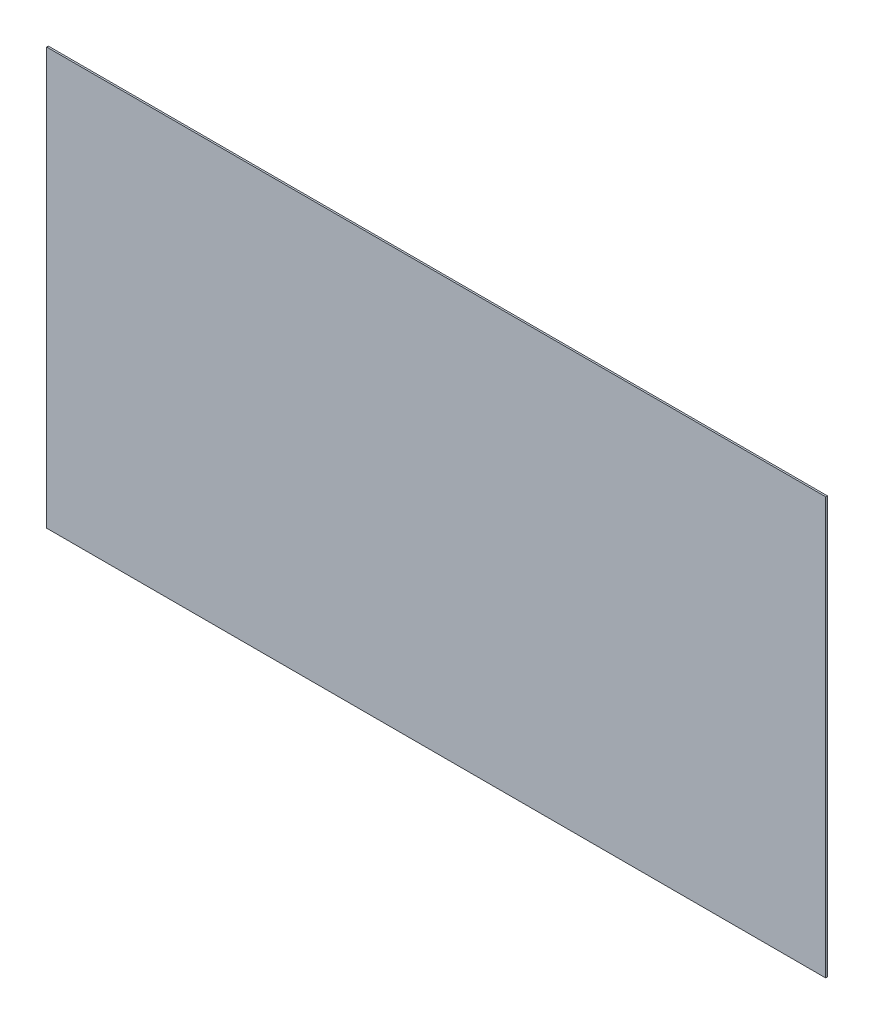
ISO-10303-21;
HEADER;
FILE_DESCRIPTION(('STEP AP214'),'2;1');
FILE_NAME('part.step','',(''),(''),'','','');
FILE_SCHEMA(('AUTOMOTIVE_DESIGN { 1 0 10303 214 1 1 1 1 }'));
ENDSEC;
DATA;
#1=APPLICATION_CONTEXT('core data for automotive mechanical design processes');
#2=APPLICATION_PROTOCOL_DEFINITION('international standard','automotive_design',2000,#1);
#3=PRODUCT_CONTEXT('',#1,'mechanical');
#4=PRODUCT('Part','Part','',(#3));
#5=PRODUCT_RELATED_PRODUCT_CATEGORY('part','',(#4));
#6=PRODUCT_DEFINITION_FORMATION('','',#4);
#7=PRODUCT_DEFINITION_CONTEXT('part definition',#1,'design');
#8=PRODUCT_DEFINITION('design','',#6,#7);
#9=PRODUCT_DEFINITION_SHAPE('','',#8);
#10=(LENGTH_UNIT() NAMED_UNIT(*) SI_UNIT(.MILLI.,.METRE.));
#11=(NAMED_UNIT(*) PLANE_ANGLE_UNIT() SI_UNIT($,.RADIAN.));
#12=(NAMED_UNIT(*) SI_UNIT($,.STERADIAN.) SOLID_ANGLE_UNIT());
#13=UNCERTAINTY_MEASURE_WITH_UNIT(LENGTH_MEASURE(1.E-05),#10,'distance_accuracy_value','');
#14=(GEOMETRIC_REPRESENTATION_CONTEXT(3) GLOBAL_UNCERTAINTY_ASSIGNED_CONTEXT((#13)) GLOBAL_UNIT_ASSIGNED_CONTEXT((#10,
#11,#12)) REPRESENTATION_CONTEXT('',''));
#15=CARTESIAN_POINT('',(0.,0.,0.));
#16=DIRECTION('',(0.,0.,1.));
#17=DIRECTION('',(1.,0.,0.));
#18=AXIS2_PLACEMENT_3D('',#15,#16,#17);
#19=CARTESIAN_POINT('',(-1162.,-621.5,1.193711796077E-12));
#20=DIRECTION('',(0.,0.,1.));
#21=DIRECTION('',(0.,-1.,0.));
#22=AXIS2_PLACEMENT_3D('',#19,#20,#21);
#23=PLANE('',#22);
#24=DIRECTION('',(0.,1.,0.));
#25=VECTOR('',#24,1.);
#26=CARTESIAN_POINT('',(-1162.,-621.5,1.193711796077E-12));
#27=LINE('',#26,#25);
#28=CARTESIAN_POINT('',(-1162.,-621.5,9.094947017729E-13));
#29=VERTEX_POINT('',#28);
#30=CARTESIAN_POINT('',(-1162.,621.5,9.094947017729E-13));
#31=VERTEX_POINT('',#30);
#32=EDGE_CURVE('E169',#29,#31,#27,.T.);
#33=ORIENTED_EDGE('',*,*,#32,.F.);
#34=DIRECTION('',(1.,0.,0.));
#35=VECTOR('',#34,1.);
#36=CARTESIAN_POINT('',(-1162.,-621.5,1.193711796077E-12));
#37=LINE('',#36,#35);
#38=CARTESIAN_POINT('',(1162.,-621.5,9.094947017729E-13));
#39=VERTEX_POINT('',#38);
#40=EDGE_CURVE('E78',#29,#39,#37,.T.);
#41=ORIENTED_EDGE('',*,*,#40,.T.);
#42=DIRECTION('',(0.,1.,0.));
#43=VECTOR('',#42,1.);
#44=CARTESIAN_POINT('',(1162.,-621.5,1.250555214938E-12));
#45=LINE('',#44,#43);
#46=CARTESIAN_POINT('',(1162.,621.5,9.094947017729E-13));
#47=VERTEX_POINT('',#46);
#48=EDGE_CURVE('E90',#39,#47,#45,.T.);
#49=ORIENTED_EDGE('',*,*,#48,.T.);
#50=DIRECTION('',(1.,0.,0.));
#51=VECTOR('',#50,1.);
#52=CARTESIAN_POINT('',(-1162.,621.5,1.136868377216E-12));
#53=LINE('',#52,#51);
#54=EDGE_CURVE('E11',#31,#47,#53,.T.);
#55=ORIENTED_EDGE('',*,*,#54,.F.);
#56=EDGE_LOOP('',(#33,#41,#49,#55));
#57=FACE_BOUND('',#56,.T.);
#58=ADVANCED_FACE('F17',(#57),#23,.T.);
#59=CARTESIAN_POINT('',(-1162.,-621.5,-4.999999999999));
#60=DIRECTION('',(0.,0.,1.));
#61=DIRECTION('',(0.,-1.,0.));
#62=AXIS2_PLACEMENT_3D('',#59,#60,#61);
#63=PLANE('',#62);
#64=DIRECTION('',(1.,0.,0.));
#65=VECTOR('',#64,1.);
#66=CARTESIAN_POINT('',(-1162.,621.5,-4.999999999999));
#67=LINE('',#66,#65);
#68=CARTESIAN_POINT('',(-1162.,621.5,-4.999999999999));
#69=VERTEX_POINT('',#68);
#70=CARTESIAN_POINT('',(1162.,621.5,-4.999999999999));
#71=VERTEX_POINT('',#70);
#72=EDGE_CURVE('E25',#69,#71,#67,.T.);
#73=ORIENTED_EDGE('',*,*,#72,.T.);
#74=DIRECTION('',(0.,1.,0.));
#75=VECTOR('',#74,1.);
#76=CARTESIAN_POINT('',(1162.,-621.5,-4.999999999999));
#77=LINE('',#76,#75);
#78=CARTESIAN_POINT('',(1162.,-621.5,-4.999999999999));
#79=VERTEX_POINT('',#78);
#80=EDGE_CURVE('E81',#79,#71,#77,.T.);
#81=ORIENTED_EDGE('',*,*,#80,.F.);
#82=DIRECTION('',(1.,0.,0.));
#83=VECTOR('',#82,1.);
#84=CARTESIAN_POINT('',(-1162.,-621.5,-4.999999999999));
#85=LINE('',#84,#83);
#86=CARTESIAN_POINT('',(-1162.,-621.5,-4.999999999999));
#87=VERTEX_POINT('',#86);
#88=EDGE_CURVE('E70',#87,#79,#85,.T.);
#89=ORIENTED_EDGE('',*,*,#88,.F.);
#90=DIRECTION('',(0.,1.,0.));
#91=VECTOR('',#90,1.);
#92=CARTESIAN_POINT('',(-1162.,-621.5,-4.999999999999));
#93=LINE('',#92,#91);
#94=EDGE_CURVE('E96',#87,#69,#93,.T.);
#95=ORIENTED_EDGE('',*,*,#94,.T.);
#96=EDGE_LOOP('',(#73,#81,#89,#95));
#97=FACE_BOUND('',#96,.T.);
#98=ADVANCED_FACE('F82',(#97),#63,.F.);
#99=CARTESIAN_POINT('',(-1162.,621.5,-4.999999999999));
#100=DIRECTION('',(0.,1.,0.));
#101=DIRECTION('',(1.,0.,0.));
#102=AXIS2_PLACEMENT_3D('',#99,#100,#101);
#103=PLANE('',#102);
#104=ORIENTED_EDGE('',*,*,#72,.F.);
#105=DIRECTION('',(0.,0.,1.));
#106=VECTOR('',#105,1.);
#107=CARTESIAN_POINT('',(-1162.,621.5,-4.999999999999));
#108=LINE('',#107,#106);
#109=EDGE_CURVE('E172',#69,#31,#108,.T.);
#110=ORIENTED_EDGE('',*,*,#109,.T.);
#111=ORIENTED_EDGE('',*,*,#54,.T.);
#112=DIRECTION('',(0.,0.,1.));
#113=VECTOR('',#112,1.);
#114=CARTESIAN_POINT('',(1162.,621.5,-4.999999999999));
#115=LINE('',#114,#113);
#116=EDGE_CURVE('E86',#71,#47,#115,.T.);
#117=ORIENTED_EDGE('',*,*,#116,.F.);
#118=EDGE_LOOP('',(#104,#110,#111,#117));
#119=FACE_BOUND('',#118,.T.);
#120=ADVANCED_FACE('F129',(#119),#103,.T.);
#121=CARTESIAN_POINT('',(-1162.,-621.5,-4.999999999999));
#122=DIRECTION('',(0.,1.,0.));
#123=DIRECTION('',(1.,0.,0.));
#124=AXIS2_PLACEMENT_3D('',#121,#122,#123);
#125=PLANE('',#124);
#126=DIRECTION('',(0.,0.,1.));
#127=VECTOR('',#126,1.);
#128=CARTESIAN_POINT('',(1162.,-621.5,-4.999999999999));
#129=LINE('',#128,#127);
#130=EDGE_CURVE('E73',#79,#39,#129,.T.);
#131=ORIENTED_EDGE('',*,*,#130,.T.);
#132=ORIENTED_EDGE('',*,*,#40,.F.);
#133=DIRECTION('',(0.,0.,1.));
#134=VECTOR('',#133,1.);
#135=CARTESIAN_POINT('',(-1162.,-621.5,-4.999999999999));
#136=LINE('',#135,#134);
#137=EDGE_CURVE('E75',#87,#29,#136,.T.);
#138=ORIENTED_EDGE('',*,*,#137,.F.);
#139=ORIENTED_EDGE('',*,*,#88,.T.);
#140=EDGE_LOOP('',(#131,#132,#138,#139));
#141=FACE_BOUND('',#140,.T.);
#142=ADVANCED_FACE('F71',(#141),#125,.F.);
#143=CARTESIAN_POINT('',(1162.,-621.5,-4.999999999999));
#144=DIRECTION('',(1.,0.,0.));
#145=DIRECTION('',(0.,-1.,0.));
#146=AXIS2_PLACEMENT_3D('',#143,#144,#145);
#147=PLANE('',#146);
#148=ORIENTED_EDGE('',*,*,#130,.F.);
#149=ORIENTED_EDGE('',*,*,#80,.T.);
#150=ORIENTED_EDGE('',*,*,#116,.T.);
#151=ORIENTED_EDGE('',*,*,#48,.F.);
#152=EDGE_LOOP('',(#148,#149,#150,#151));
#153=FACE_BOUND('',#152,.T.);
#154=ADVANCED_FACE('F89',(#153),#147,.T.);
#155=CARTESIAN_POINT('',(-1162.,-621.5,-4.999999999999));
#156=DIRECTION('',(1.,0.,0.));
#157=DIRECTION('',(0.,-1.,0.));
#158=AXIS2_PLACEMENT_3D('',#155,#156,#157);
#159=PLANE('',#158);
#160=ORIENTED_EDGE('',*,*,#32,.T.);
#161=ORIENTED_EDGE('',*,*,#109,.F.);
#162=ORIENTED_EDGE('',*,*,#94,.F.);
#163=ORIENTED_EDGE('',*,*,#137,.T.);
#164=EDGE_LOOP('',(#160,#161,#162,#163));
#165=FACE_BOUND('',#164,.T.);
#166=ADVANCED_FACE('F113',(#165),#159,.F.);
#167=CLOSED_SHELL('',(#58,#98,#120,#142,#154,#166));
#168=MANIFOLD_SOLID_BREP('B1',#167);
#169=ADVANCED_BREP_SHAPE_REPRESENTATION('',(#18,#168),#14);
#170=SHAPE_DEFINITION_REPRESENTATION(#9,#169);
ENDSEC;
END-ISO-10303-21;
